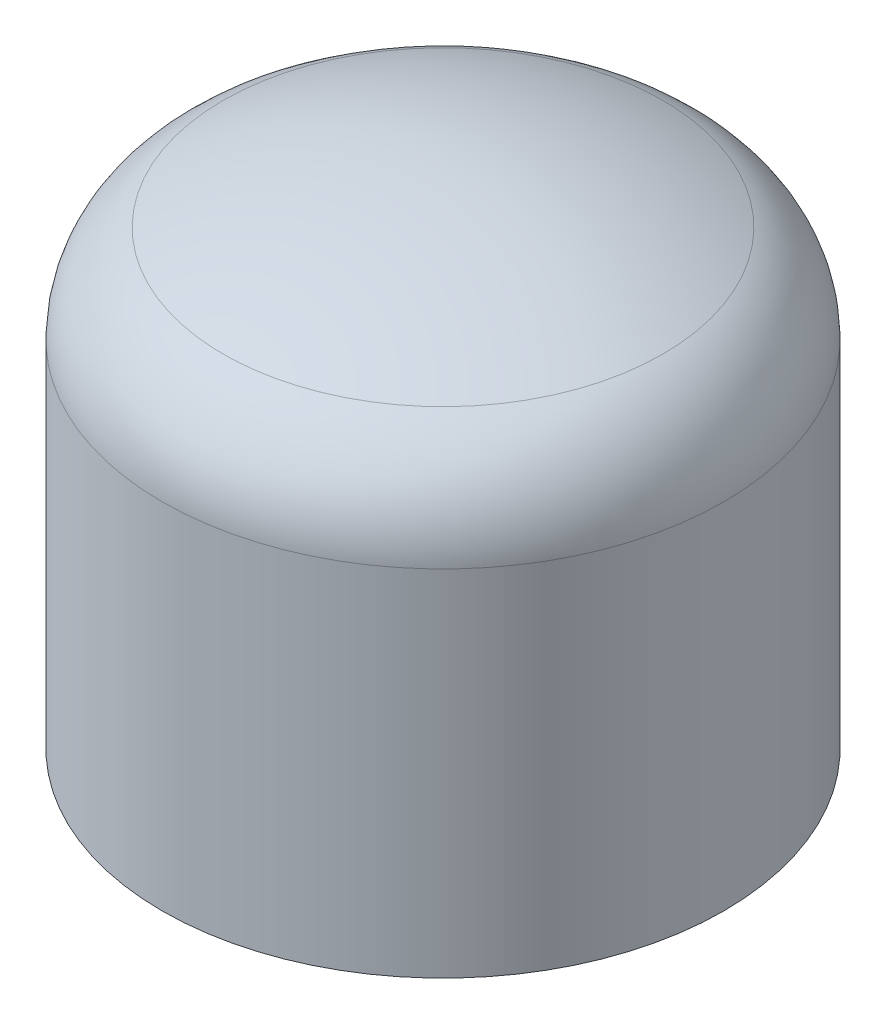
ISO-10303-21;
HEADER;
FILE_DESCRIPTION(('STEP AP214'),'2;1');
FILE_NAME('part.step','',(''),(''),'','','');
FILE_SCHEMA(('AUTOMOTIVE_DESIGN { 1 0 10303 214 1 1 1 1 }'));
ENDSEC;
DATA;
#1=APPLICATION_CONTEXT('core data for automotive mechanical design processes');
#2=APPLICATION_PROTOCOL_DEFINITION('international standard','automotive_design',2000,#1);
#3=PRODUCT_CONTEXT('',#1,'mechanical');
#4=PRODUCT('Part','Part','',(#3));
#5=PRODUCT_RELATED_PRODUCT_CATEGORY('part','',(#4));
#6=PRODUCT_DEFINITION_FORMATION('','',#4);
#7=PRODUCT_DEFINITION_CONTEXT('part definition',#1,'design');
#8=PRODUCT_DEFINITION('design','',#6,#7);
#9=PRODUCT_DEFINITION_SHAPE('','',#8);
#10=(LENGTH_UNIT() NAMED_UNIT(*) SI_UNIT(.MILLI.,.METRE.));
#11=(NAMED_UNIT(*) PLANE_ANGLE_UNIT() SI_UNIT($,.RADIAN.));
#12=(NAMED_UNIT(*) SI_UNIT($,.STERADIAN.) SOLID_ANGLE_UNIT());
#13=UNCERTAINTY_MEASURE_WITH_UNIT(LENGTH_MEASURE(1.E-05),#10,'distance_accuracy_value','');
#14=(GEOMETRIC_REPRESENTATION_CONTEXT(3) GLOBAL_UNCERTAINTY_ASSIGNED_CONTEXT((#13)) GLOBAL_UNIT_ASSIGNED_CONTEXT((#10,
#11,#12)) REPRESENTATION_CONTEXT('',''));
#15=CARTESIAN_POINT('',(0.,0.,0.));
#16=DIRECTION('',(0.,0.,1.));
#17=DIRECTION('',(1.,0.,0.));
#18=AXIS2_PLACEMENT_3D('',#15,#16,#17);
#19=CARTESIAN_POINT('',(0.,0.,0.));
#20=DIRECTION('',(0.,-1.,0.));
#21=DIRECTION('',(-1.,0.,0.));
#22=AXIS2_PLACEMENT_3D('',#19,#20,#21);
#23=SPHERICAL_SURFACE('',#22,102.);
#24=CARTESIAN_POINT('',(-3.14623391386906E-13,91.7202778833559,0.));
#25=DIRECTION('',(0.,-1.,0.));
#26=DIRECTION('',(1.,0.,0.));
#27=AXIS2_PLACEMENT_3D('',#24,#25,#26);
#28=CIRCLE('',#27,44.6249999999997);
#29=CARTESIAN_POINT('',(44.6249999999994,91.7202778833561,0.));
#30=VERTEX_POINT('',#29);
#31=EDGE_CURVE('E52',#30,#30,#28,.T.);
#32=ORIENTED_EDGE('',*,*,#31,.F.);
#33=EDGE_LOOP('',(#32));
#34=FACE_BOUND('',#33,.T.);
#35=ADVANCED_FACE('F44',(#34),#23,.T.);
#36=CARTESIAN_POINT('',(-2.4980018054066E-13,71.9374728496909,0.));
#37=DIRECTION('',(0.,-1.,0.));
#38=DIRECTION('',(1.,0.,0.));
#39=AXIS2_PLACEMENT_3D('',#36,#37,#38);
#40=TOROIDAL_SURFACE('',#39,34.9999999999997,22.);
#41=CARTESIAN_POINT('',(-2.46763444225025E-13,71.937472849691,0.));
#42=DIRECTION('',(0.,-1.,0.));
#43=DIRECTION('',(1.,0.,0.));
#44=AXIS2_PLACEMENT_3D('',#41,#42,#43);
#45=CIRCLE('',#44,56.9999999999997);
#46=CARTESIAN_POINT('',(56.9999999999995,71.9374728496912,0.));
#47=VERTEX_POINT('',#46);
#48=EDGE_CURVE('E127',#47,#47,#45,.T.);
#49=ORIENTED_EDGE('',*,*,#48,.F.);
#50=EDGE_LOOP('',(#49));
#51=FACE_BOUND('',#50,.T.);
#52=ORIENTED_EDGE('',*,*,#31,.T.);
#53=EDGE_LOOP('',(#52));
#54=FACE_BOUND('',#53,.T.);
#55=ADVANCED_FACE('F132',(#51,#54),#40,.T.);
#56=CARTESIAN_POINT('',(2.87797653014617E-13,-83.8999306196434,0.));
#57=DIRECTION('',(0.,-1.,0.));
#58=DIRECTION('',(1.,0.,0.));
#59=AXIS2_PLACEMENT_3D('',#56,#57,#58);
#60=CYLINDRICAL_SURFACE('',#59,56.9999999999999);
#61=CARTESIAN_POINT('',(0.,1.94289029309402E-13,0.));
#62=DIRECTION('',(0.,-1.,0.));
#63=DIRECTION('',(1.,0.,0.));
#64=AXIS2_PLACEMENT_3D('',#61,#62,#63);
#65=CIRCLE('',#64,57.);
#66=CARTESIAN_POINT('',(57.,3.89813222245891E-13,0.));
#67=VERTEX_POINT('',#66);
#68=EDGE_CURVE('E124',#67,#67,#65,.T.);
#69=ORIENTED_EDGE('',*,*,#68,.F.);
#70=EDGE_LOOP('',(#69));
#71=FACE_BOUND('',#70,.T.);
#72=ORIENTED_EDGE('',*,*,#48,.T.);
#73=EDGE_LOOP('',(#72));
#74=FACE_BOUND('',#73,.T.);
#75=ADVANCED_FACE('F138',(#71,#74),#60,.T.);
#76=CARTESIAN_POINT('',(-57.,0.,0.));
#77=DIRECTION('',(0.,1.,0.));
#78=DIRECTION('',(-1.,0.,0.));
#79=AXIS2_PLACEMENT_3D('',#76,#77,#78);
#80=PLANE('',#79);
#81=CARTESIAN_POINT('',(0.,1.94289029309402E-13,0.));
#82=DIRECTION('',(0.,-1.,0.));
#83=DIRECTION('',(1.,0.,0.));
#84=AXIS2_PLACEMENT_3D('',#81,#82,#83);
#85=CIRCLE('',#84,55.);
#86=CARTESIAN_POINT('',(55.,3.8295272424812E-13,0.));
#87=VERTEX_POINT('',#86);
#88=EDGE_CURVE('E121',#87,#87,#85,.T.);
#89=ORIENTED_EDGE('',*,*,#88,.F.);
#90=EDGE_LOOP('',(#89));
#91=FACE_BOUND('',#90,.T.);
#92=ORIENTED_EDGE('',*,*,#68,.T.);
#93=EDGE_LOOP('',(#92));
#94=FACE_BOUND('',#93,.T.);
#95=ADVANCED_FACE('F145',(#91,#94),#80,.F.);
#96=CARTESIAN_POINT('',(2.87797653014617E-13,-83.8999306196434,0.));
#97=DIRECTION('',(0.,-1.,0.));
#98=DIRECTION('',(1.,0.,0.));
#99=AXIS2_PLACEMENT_3D('',#96,#97,#98);
#100=CYLINDRICAL_SURFACE('',#99,54.9999999999999);
#101=CARTESIAN_POINT('',(-1.02907469966573E-13,30.,0.));
#102=DIRECTION('',(0.,-1.,0.));
#103=DIRECTION('',(1.,0.,0.));
#104=AXIS2_PLACEMENT_3D('',#101,#102,#103);
#105=CIRCLE('',#104,54.9999999999997);
#106=CARTESIAN_POINT('',(-55.,29.9999999999998,-1.88663694938717E-13));
#107=VERTEX_POINT('',#106);
#108=CARTESIAN_POINT('',(-4.79356585112129,30.,54.7907083950457));
#109=VERTEX_POINT('',#108);
#110=EDGE_CURVE('E107',#107,#109,#105,.T.);
#111=ORIENTED_EDGE('',*,*,#110,.F.);
#112=DIRECTION('',(0.,-1.,0.));
#113=VECTOR('',#112,1.);
#114=CARTESIAN_POINT('',(-55.0000000000002,102.001,-1.88663694938717E-13));
#115=LINE('',#114,#113);
#116=CARTESIAN_POINT('',(-55.,31.9999999999998,-2.05502588426993E-13));
#117=VERTEX_POINT('',#116);
#118=EDGE_CURVE('E83',#117,#107,#115,.T.);
#119=ORIENTED_EDGE('',*,*,#118,.F.);
#120=CARTESIAN_POINT('',(-1.09767967964345E-13,32.,0.));
#121=DIRECTION('',(0.,-1.,0.));
#122=DIRECTION('',(1.,0.,0.));
#123=AXIS2_PLACEMENT_3D('',#120,#121,#122);
#124=CIRCLE('',#123,54.9999999999999);
#125=CARTESIAN_POINT('',(-4.7935658511213,32.0000000000002,54.7907083950457));
#126=VERTEX_POINT('',#125);
#127=EDGE_CURVE('E11',#126,#117,#124,.F.);
#128=ORIENTED_EDGE('',*,*,#127,.F.);
#129=DIRECTION('',(0.,-1.,0.));
#130=VECTOR('',#129,1.);
#131=CARTESIAN_POINT('',(-4.79356585112154,102.001,54.7907083950457));
#132=LINE('',#131,#130);
#133=EDGE_CURVE('E88',#126,#109,#132,.T.);
#134=ORIENTED_EDGE('',*,*,#133,.T.);
#135=EDGE_LOOP('',(#111,#119,#128,#134));
#136=FACE_BOUND('',#135,.T.);
#137=ORIENTED_EDGE('',*,*,#88,.T.);
#138=EDGE_LOOP('',(#137));
#139=FACE_BOUND('',#138,.T.);
#140=CARTESIAN_POINT('',(-2.46763444225025E-13,71.937472849691,0.));
#141=DIRECTION('',(0.,-1.,0.));
#142=DIRECTION('',(1.,0.,0.));
#143=AXIS2_PLACEMENT_3D('',#140,#141,#142);
#144=CIRCLE('',#143,54.9999999999997);
#145=CARTESIAN_POINT('',(54.9999999999995,71.9374728496912,0.));
#146=VERTEX_POINT('',#145);
#147=EDGE_CURVE('E118',#146,#146,#144,.T.);
#148=ORIENTED_EDGE('',*,*,#147,.F.);
#149=EDGE_LOOP('',(#148));
#150=FACE_BOUND('',#149,.T.);
#151=ADVANCED_FACE('F149',(#136,#139,#150),#100,.F.);
#152=CARTESIAN_POINT('',(-1.09767967964345E-13,32.,0.));
#153=DIRECTION('',(0.,-1.,0.));
#154=DIRECTION('',(1.,0.,0.));
#155=AXIS2_PLACEMENT_3D('',#152,#153,#154);
#156=PLANE('',#155);
#157=CARTESIAN_POINT('',(-43.3012701892189,31.9999999999998,-25.0000000000018));
#158=DIRECTION('',(0.,-1.,0.));
#159=DIRECTION('',(1.,0.,0.));
#160=AXIS2_PLACEMENT_3D('',#157,#158,#159);
#161=CIRCLE('',#160,2.25000000000401);
#162=CARTESIAN_POINT('',(-41.0512701892149,31.9999999999999,-25.0000000000018));
#163=VERTEX_POINT('',#162);
#164=EDGE_CURVE('E354',#163,#163,#161,.T.);
#165=ORIENTED_EDGE('',*,*,#164,.T.);
#166=EDGE_LOOP('',(#165));
#167=FACE_BOUND('',#166,.T.);
#168=CARTESIAN_POINT('',(43.301270189225,32.0000000000001,-24.9999999999982));
#169=DIRECTION('',(0.,-1.,0.));
#170=DIRECTION('',(1.,0.,0.));
#171=AXIS2_PLACEMENT_3D('',#168,#169,#170);
#172=CIRCLE('',#171,2.25000000000274);
#173=CARTESIAN_POINT('',(45.5512701892278,32.0000000000002,-24.9999999999982));
#174=VERTEX_POINT('',#173);
#175=EDGE_CURVE('E360',#174,#174,#172,.T.);
#176=ORIENTED_EDGE('',*,*,#175,.T.);
#177=EDGE_LOOP('',(#176));
#178=FACE_BOUND('',#177,.T.);
#179=CARTESIAN_POINT('',(-1.09767967964345E-13,32.,50.));
#180=DIRECTION('',(0.,-1.,0.));
#181=DIRECTION('',(1.,0.,0.));
#182=AXIS2_PLACEMENT_3D('',#179,#180,#181);
#183=CIRCLE('',#182,2.25);
#184=CARTESIAN_POINT('',(2.24999999999989,32.,50.));
#185=VERTEX_POINT('',#184);
#186=EDGE_CURVE('E105',#185,#185,#183,.T.);
#187=ORIENTED_EDGE('',*,*,#186,.T.);
#188=EDGE_LOOP('',(#187));
#189=FACE_BOUND('',#188,.T.);
#190=CARTESIAN_POINT('',(-1.09767967964345E-13,32.,0.));
#191=DIRECTION('',(0.,-1.,0.));
#192=DIRECTION('',(1.,0.,0.));
#193=AXIS2_PLACEMENT_3D('',#190,#191,#192);
#194=CIRCLE('',#193,45.);
#195=CARTESIAN_POINT('',(-45.0000000000001,32.0000000000002,-1.68138481440267E-13));
#196=VERTEX_POINT('',#195);
#197=CARTESIAN_POINT('',(-3.92200842364474,32.0000000000002,44.8287614141286));
#198=VERTEX_POINT('',#197);
#199=EDGE_CURVE('E98',#196,#198,#194,.T.);
#200=ORIENTED_EDGE('',*,*,#199,.T.);
#201=DIRECTION('',(0.0871557427476583,0.,-0.996194698091746));
#202=VECTOR('',#201,1.);
#203=CARTESIAN_POINT('',(-1.09767967964345E-13,32.,0.));
#204=LINE('',#203,#202);
#205=EDGE_CURVE('E343',#126,#198,#204,.T.);
#206=ORIENTED_EDGE('',*,*,#205,.F.);
#207=ORIENTED_EDGE('',*,*,#127,.T.);
#208=DIRECTION('',(-1.,0.,0.));
#209=VECTOR('',#208,1.);
#210=CARTESIAN_POINT('',(-1.09767967964345E-13,32.,0.));
#211=LINE('',#210,#209);
#212=EDGE_CURVE('E59',#196,#117,#211,.T.);
#213=ORIENTED_EDGE('',*,*,#212,.F.);
#214=EDGE_LOOP('',(#200,#206,#207,#213));
#215=FACE_BOUND('',#214,.T.);
#216=ADVANCED_FACE('F153',(#167,#178,#189,#215),#156,.F.);
#217=CARTESIAN_POINT('',(-1.02907469966573E-13,30.,0.));
#218=DIRECTION('',(0.,-1.,0.));
#219=DIRECTION('',(1.,0.,0.));
#220=AXIS2_PLACEMENT_3D('',#217,#218,#219);
#221=PLANE('',#220);
#222=DIRECTION('',(-0.0871557427476583,0.,0.996194698091745));
#223=VECTOR('',#222,1.);
#224=CARTESIAN_POINT('',(-1.02907469966573E-13,30.,0.));
#225=LINE('',#224,#223);
#226=CARTESIAN_POINT('',(-3.92200842364473,30.,44.8287614141286));
#227=VERTEX_POINT('',#226);
#228=EDGE_CURVE('E89',#227,#109,#225,.T.);
#229=ORIENTED_EDGE('',*,*,#228,.F.);
#230=CARTESIAN_POINT('',(-1.02907469966573E-13,30.,0.));
#231=DIRECTION('',(0.,-1.,0.));
#232=DIRECTION('',(1.,0.,0.));
#233=AXIS2_PLACEMENT_3D('',#230,#231,#232);
#234=CIRCLE('',#233,45.);
#235=CARTESIAN_POINT('',(-45.0000000000001,29.9999999999998,-1.68138481440267E-13));
#236=VERTEX_POINT('',#235);
#237=EDGE_CURVE('E96',#236,#227,#234,.T.);
#238=ORIENTED_EDGE('',*,*,#237,.F.);
#239=DIRECTION('',(1.,0.,0.));
#240=VECTOR('',#239,1.);
#241=CARTESIAN_POINT('',(-1.02907469966573E-13,30.,0.));
#242=LINE('',#241,#240);
#243=EDGE_CURVE('E81',#107,#236,#242,.T.);
#244=ORIENTED_EDGE('',*,*,#243,.F.);
#245=ORIENTED_EDGE('',*,*,#110,.T.);
#246=EDGE_LOOP('',(#229,#238,#244,#245));
#247=FACE_BOUND('',#246,.T.);
#248=CARTESIAN_POINT('',(-43.3012701892189,29.9999999999999,-25.0000000000018));
#249=DIRECTION('',(0.,-1.,0.));
#250=DIRECTION('',(1.,0.,0.));
#251=AXIS2_PLACEMENT_3D('',#248,#249,#250);
#252=CIRCLE('',#251,2.25000000000401);
#253=CARTESIAN_POINT('',(-41.0512701892149,29.9999999999999,-25.0000000000018));
#254=VERTEX_POINT('',#253);
#255=EDGE_CURVE('E352',#254,#254,#252,.T.);
#256=ORIENTED_EDGE('',*,*,#255,.F.);
#257=EDGE_LOOP('',(#256));
#258=FACE_BOUND('',#257,.T.);
#259=CARTESIAN_POINT('',(43.301270189225,30.0000000000001,-24.9999999999982));
#260=DIRECTION('',(0.,-1.,0.));
#261=DIRECTION('',(1.,0.,0.));
#262=AXIS2_PLACEMENT_3D('',#259,#260,#261);
#263=CIRCLE('',#262,2.25000000000274);
#264=CARTESIAN_POINT('',(45.5512701892278,30.0000000000002,-24.9999999999982));
#265=VERTEX_POINT('',#264);
#266=EDGE_CURVE('E357',#265,#265,#263,.T.);
#267=ORIENTED_EDGE('',*,*,#266,.F.);
#268=EDGE_LOOP('',(#267));
#269=FACE_BOUND('',#268,.T.);
#270=CARTESIAN_POINT('',(-1.02907469966573E-13,30.,50.));
#271=DIRECTION('',(0.,-1.,0.));
#272=DIRECTION('',(1.,0.,0.));
#273=AXIS2_PLACEMENT_3D('',#270,#271,#272);
#274=CIRCLE('',#273,2.25);
#275=CARTESIAN_POINT('',(2.2499999999999,30.,50.));
#276=VERTEX_POINT('',#275);
#277=EDGE_CURVE('E110',#276,#276,#274,.T.);
#278=ORIENTED_EDGE('',*,*,#277,.F.);
#279=EDGE_LOOP('',(#278));
#280=FACE_BOUND('',#279,.T.);
#281=ADVANCED_FACE('F102',(#247,#258,#269,#280),#221,.T.);
#282=CARTESIAN_POINT('',(-1.09767967964345E-13,32.,0.));
#283=DIRECTION('',(0.,-1.,0.));
#284=DIRECTION('',(1.,0.,0.));
#285=AXIS2_PLACEMENT_3D('',#282,#283,#284);
#286=CYLINDRICAL_SURFACE('',#285,45.);
#287=ORIENTED_EDGE('',*,*,#237,.T.);
#288=DIRECTION('',(0.,-1.,0.));
#289=VECTOR('',#288,1.);
#290=CARTESIAN_POINT('',(-3.92200842364474,32.,44.8287614141286));
#291=LINE('',#290,#289);
#292=EDGE_CURVE('E99',#198,#227,#291,.T.);
#293=ORIENTED_EDGE('',*,*,#292,.F.);
#294=ORIENTED_EDGE('',*,*,#199,.F.);
#295=DIRECTION('',(0.,-1.,0.));
#296=VECTOR('',#295,1.);
#297=CARTESIAN_POINT('',(-45.0000000000001,31.9999999999998,-1.68138481440267E-13));
#298=LINE('',#297,#296);
#299=EDGE_CURVE('E65',#236,#196,#298,.F.);
#300=ORIENTED_EDGE('',*,*,#299,.F.);
#301=EDGE_LOOP('',(#287,#293,#294,#300));
#302=FACE_BOUND('',#301,.T.);
#303=ADVANCED_FACE('F94',(#302),#286,.F.);
#304=CARTESIAN_POINT('',(-1.09767967964345E-13,32.,50.));
#305=DIRECTION('',(0.,-1.,0.));
#306=DIRECTION('',(1.,0.,0.));
#307=AXIS2_PLACEMENT_3D('',#304,#305,#306);
#308=CYLINDRICAL_SURFACE('',#307,2.25);
#309=ORIENTED_EDGE('',*,*,#186,.F.);
#310=EDGE_LOOP('',(#309));
#311=FACE_BOUND('',#310,.T.);
#312=ORIENTED_EDGE('',*,*,#277,.T.);
#313=EDGE_LOOP('',(#312));
#314=FACE_BOUND('',#313,.T.);
#315=ADVANCED_FACE('F167',(#311,#314),#308,.F.);
#316=CARTESIAN_POINT('',(43.301270189225,32.0000000000001,-24.9999999999982));
#317=DIRECTION('',(0.,-1.,0.));
#318=DIRECTION('',(1.,0.,0.));
#319=AXIS2_PLACEMENT_3D('',#316,#317,#318);
#320=CYLINDRICAL_SURFACE('',#319,2.25000000000274);
#321=ORIENTED_EDGE('',*,*,#175,.F.);
#322=EDGE_LOOP('',(#321));
#323=FACE_BOUND('',#322,.T.);
#324=ORIENTED_EDGE('',*,*,#266,.T.);
#325=EDGE_LOOP('',(#324));
#326=FACE_BOUND('',#325,.T.);
#327=ADVANCED_FACE('F170',(#323,#326),#320,.F.);
#328=CARTESIAN_POINT('',(-43.3012701892189,31.9999999999998,-25.0000000000018));
#329=DIRECTION('',(0.,-1.,0.));
#330=DIRECTION('',(1.,0.,0.));
#331=AXIS2_PLACEMENT_3D('',#328,#329,#330);
#332=CYLINDRICAL_SURFACE('',#331,2.25000000000401);
#333=ORIENTED_EDGE('',*,*,#164,.F.);
#334=EDGE_LOOP('',(#333));
#335=FACE_BOUND('',#334,.T.);
#336=ORIENTED_EDGE('',*,*,#255,.T.);
#337=EDGE_LOOP('',(#336));
#338=FACE_BOUND('',#337,.T.);
#339=ADVANCED_FACE('F174',(#335,#338),#332,.F.);
#340=CARTESIAN_POINT('',(0.,0.,0.));
#341=DIRECTION('',(0.,-1.,0.));
#342=DIRECTION('',(-1.,0.,0.));
#343=AXIS2_PLACEMENT_3D('',#340,#341,#342);
#344=SPHERICAL_SURFACE('',#343,100.);
#345=CARTESIAN_POINT('',(-3.0845430528128E-13,89.9218410621136,0.));
#346=DIRECTION('',(0.,-1.,0.));
#347=DIRECTION('',(1.,0.,0.));
#348=AXIS2_PLACEMENT_3D('',#345,#346,#347);
#349=CIRCLE('',#348,43.7499999999997);
#350=CARTESIAN_POINT('',(43.7499999999994,89.9218410621138,0.));
#351=VERTEX_POINT('',#350);
#352=EDGE_CURVE('E115',#351,#351,#349,.T.);
#353=ORIENTED_EDGE('',*,*,#352,.T.);
#354=EDGE_LOOP('',(#353));
#355=FACE_BOUND('',#354,.T.);
#356=ADVANCED_FACE('F46',(#355),#344,.F.);
#357=CARTESIAN_POINT('',(-2.4980018054066E-13,71.9374728496909,0.));
#358=DIRECTION('',(0.,-1.,0.));
#359=DIRECTION('',(1.,0.,0.));
#360=AXIS2_PLACEMENT_3D('',#357,#358,#359);
#361=TOROIDAL_SURFACE('',#360,34.9999999999997,20.);
#362=ORIENTED_EDGE('',*,*,#352,.F.);
#363=EDGE_LOOP('',(#362));
#364=FACE_BOUND('',#363,.T.);
#365=ORIENTED_EDGE('',*,*,#147,.T.);
#366=EDGE_LOOP('',(#365));
#367=FACE_BOUND('',#366,.T.);
#368=ADVANCED_FACE('F155',(#364,#367),#361,.F.);
#369=CARTESIAN_POINT('',(-3.49888828135348E-13,102.001,0.));
#370=DIRECTION('',(0.996194698091745,0.,0.0871557427476583));
#371=DIRECTION('',(0.0871557427476583,0.,-0.996194698091746));
#372=AXIS2_PLACEMENT_3D('',#369,#370,#371);
#373=PLANE('',#372);
#374=ORIENTED_EDGE('',*,*,#205,.T.);
#375=ORIENTED_EDGE('',*,*,#292,.T.);
#376=ORIENTED_EDGE('',*,*,#228,.T.);
#377=ORIENTED_EDGE('',*,*,#133,.F.);
#378=EDGE_LOOP('',(#374,#375,#376,#377));
#379=FACE_BOUND('',#378,.T.);
#380=ADVANCED_FACE('F158',(#379),#373,.F.);
#381=CARTESIAN_POINT('',(-3.49888828135348E-13,102.001,0.));
#382=DIRECTION('',(0.,0.,-1.));
#383=DIRECTION('',(-1.,0.,0.));
#384=AXIS2_PLACEMENT_3D('',#381,#382,#383);
#385=PLANE('',#384);
#386=ORIENTED_EDGE('',*,*,#212,.T.);
#387=ORIENTED_EDGE('',*,*,#118,.T.);
#388=ORIENTED_EDGE('',*,*,#243,.T.);
#389=ORIENTED_EDGE('',*,*,#299,.T.);
#390=EDGE_LOOP('',(#386,#387,#388,#389));
#391=FACE_BOUND('',#390,.T.);
#392=ADVANCED_FACE('F82',(#391),#385,.F.);
#393=CLOSED_SHELL('',(#35,#55,#75,#95,#151,#216,#281,#303,#315,#327,#339,#356,#368,#380,#392));
#394=MANIFOLD_SOLID_BREP('B2',#393);
#395=ADVANCED_BREP_SHAPE_REPRESENTATION('',(#18,#394),#14);
#396=SHAPE_DEFINITION_REPRESENTATION(#9,#395);
ENDSEC;
END-ISO-10303-21;
